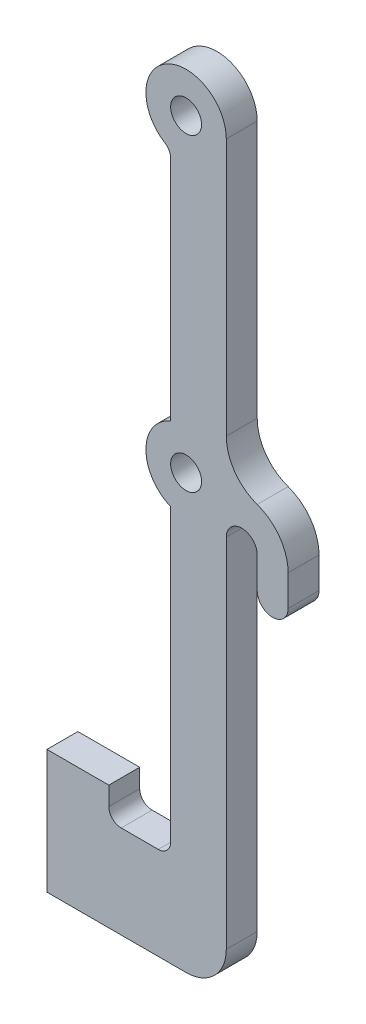
ISO-10303-21;
HEADER;
FILE_DESCRIPTION(('STEP AP214'),'2;1');
FILE_NAME('part.step','',(''),(''),'','','');
FILE_SCHEMA(('AUTOMOTIVE_DESIGN { 1 0 10303 214 1 1 1 1 }'));
ENDSEC;
DATA;
#1=APPLICATION_CONTEXT('core data for automotive mechanical design processes');
#2=APPLICATION_PROTOCOL_DEFINITION('international standard','automotive_design',2000,#1);
#3=PRODUCT_CONTEXT('',#1,'mechanical');
#4=PRODUCT('Part','Part','',(#3));
#5=PRODUCT_RELATED_PRODUCT_CATEGORY('part','',(#4));
#6=PRODUCT_DEFINITION_FORMATION('','',#4);
#7=PRODUCT_DEFINITION_CONTEXT('part definition',#1,'design');
#8=PRODUCT_DEFINITION('design','',#6,#7);
#9=PRODUCT_DEFINITION_SHAPE('','',#8);
#10=(LENGTH_UNIT() NAMED_UNIT(*) SI_UNIT(.MILLI.,.METRE.));
#11=(NAMED_UNIT(*) PLANE_ANGLE_UNIT() SI_UNIT($,.RADIAN.));
#12=(NAMED_UNIT(*) SI_UNIT($,.STERADIAN.) SOLID_ANGLE_UNIT());
#13=UNCERTAINTY_MEASURE_WITH_UNIT(LENGTH_MEASURE(1.E-05),#10,'distance_accuracy_value','');
#14=(GEOMETRIC_REPRESENTATION_CONTEXT(3) GLOBAL_UNCERTAINTY_ASSIGNED_CONTEXT((#13)) GLOBAL_UNIT_ASSIGNED_CONTEXT((#10,
#11,#12)) REPRESENTATION_CONTEXT('',''));
#15=CARTESIAN_POINT('',(0.,0.,0.));
#16=DIRECTION('',(0.,0.,1.));
#17=DIRECTION('',(1.,0.,0.));
#18=AXIS2_PLACEMENT_3D('',#15,#16,#17);
#19=CARTESIAN_POINT('',(8.255,0.,3.175));
#20=DIRECTION('',(1.,0.,0.));
#21=DIRECTION('',(0.,1.,0.));
#22=AXIS2_PLACEMENT_3D('',#19,#20,#21);
#23=PLANE('',#22);
#24=DIRECTION('',(0.,-1.,0.));
#25=VECTOR('',#24,1.);
#26=CARTESIAN_POINT('',(8.255,0.,3.175));
#27=LINE('',#26,#25);
#28=CARTESIAN_POINT('',(8.255,0.,3.175));
#29=VERTEX_POINT('',#28);
#30=CARTESIAN_POINT('',(8.255,-52.8619115344498,3.175));
#31=VERTEX_POINT('',#30);
#32=EDGE_CURVE('E282',#29,#31,#27,.T.);
#33=ORIENTED_EDGE('',*,*,#32,.T.);
#34=DIRECTION('',(0.,0.,1.));
#35=VECTOR('',#34,1.);
#36=CARTESIAN_POINT('',(8.255,-52.8619115344498,-3.175));
#37=LINE('',#36,#35);
#38=CARTESIAN_POINT('',(8.255,-52.8619115344498,-3.175));
#39=VERTEX_POINT('',#38);
#40=EDGE_CURVE('E240',#39,#31,#37,.T.);
#41=ORIENTED_EDGE('',*,*,#40,.F.);
#42=DIRECTION('',(0.,-1.,0.));
#43=VECTOR('',#42,1.);
#44=CARTESIAN_POINT('',(8.255,0.,-3.175));
#45=LINE('',#44,#43);
#46=CARTESIAN_POINT('',(8.255,0.,-3.175));
#47=VERTEX_POINT('',#46);
#48=EDGE_CURVE('E321',#47,#39,#45,.T.);
#49=ORIENTED_EDGE('',*,*,#48,.F.);
#50=DIRECTION('',(0.,0.,-1.));
#51=VECTOR('',#50,1.);
#52=CARTESIAN_POINT('',(8.255,0.,3.175));
#53=LINE('',#52,#51);
#54=EDGE_CURVE('E287',#29,#47,#53,.T.);
#55=ORIENTED_EDGE('',*,*,#54,.F.);
#56=EDGE_LOOP('',(#33,#41,#49,#55));
#57=FACE_BOUND('',#56,.T.);
#58=ADVANCED_FACE('F47',(#57),#23,.T.);
#59=CARTESIAN_POINT('',(-3.175,0.,3.175));
#60=DIRECTION('',(1.,0.,0.));
#61=DIRECTION('',(0.,1.,0.));
#62=AXIS2_PLACEMENT_3D('',#59,#60,#61);
#63=PLANE('',#62);
#64=DIRECTION('',(0.,-1.,0.));
#65=VECTOR('',#64,1.);
#66=CARTESIAN_POINT('',(-3.175,0.,3.175));
#67=LINE('',#66,#65);
#68=CARTESIAN_POINT('',(-3.175,-9.15810023967853,3.175));
#69=VERTEX_POINT('',#68);
#70=CARTESIAN_POINT('',(-3.17499999999999,-55.88,3.175));
#71=VERTEX_POINT('',#70);
#72=EDGE_CURVE('E256',#69,#71,#67,.T.);
#73=ORIENTED_EDGE('',*,*,#72,.F.);
#74=DIRECTION('',(0.,0.,1.));
#75=VECTOR('',#74,1.);
#76=CARTESIAN_POINT('',(-3.175,-9.15810023967853,-3.175));
#77=LINE('',#76,#75);
#78=CARTESIAN_POINT('',(-3.175,-9.15810023967853,-3.175));
#79=VERTEX_POINT('',#78);
#80=EDGE_CURVE('E355',#69,#79,#77,.F.);
#81=ORIENTED_EDGE('',*,*,#80,.T.);
#82=DIRECTION('',(0.,-1.,0.));
#83=VECTOR('',#82,1.);
#84=CARTESIAN_POINT('',(-3.175,0.,-3.175));
#85=LINE('',#84,#83);
#86=CARTESIAN_POINT('',(-3.17499999999999,-55.88,-3.175));
#87=VERTEX_POINT('',#86);
#88=EDGE_CURVE('E293',#79,#87,#85,.T.);
#89=ORIENTED_EDGE('',*,*,#88,.T.);
#90=DIRECTION('',(0.,0.,-1.));
#91=VECTOR('',#90,1.);
#92=CARTESIAN_POINT('',(-3.17499999999999,-55.88,3.175));
#93=LINE('',#92,#91);
#94=EDGE_CURVE('E352',#71,#87,#93,.T.);
#95=ORIENTED_EDGE('',*,*,#94,.F.);
#96=EDGE_LOOP('',(#73,#81,#89,#95));
#97=FACE_BOUND('',#96,.T.);
#98=ADVANCED_FACE('F372',(#97),#63,.F.);
#99=CARTESIAN_POINT('',(0.,-63.5,3.175));
#100=DIRECTION('',(0.,0.,-1.));
#101=DIRECTION('',(-1.,0.,0.));
#102=AXIS2_PLACEMENT_3D('',#99,#100,#101);
#103=CYLINDRICAL_SURFACE('',#102,8.255);
#104=CARTESIAN_POINT('',(0.,-63.5,-3.175));
#105=DIRECTION('',(0.,0.,1.));
#106=DIRECTION('',(1.,0.,0.));
#107=AXIS2_PLACEMENT_3D('',#104,#105,#106);
#108=CIRCLE('',#107,8.255);
#109=CARTESIAN_POINT('',(-3.17499999999999,-71.12,-3.175));
#110=VERTEX_POINT('',#109);
#111=EDGE_CURVE('E295',#87,#110,#108,.T.);
#112=ORIENTED_EDGE('',*,*,#111,.T.);
#113=DIRECTION('',(0.,0.,-1.));
#114=VECTOR('',#113,1.);
#115=CARTESIAN_POINT('',(-3.17499999999999,-71.12,3.175));
#116=LINE('',#115,#114);
#117=CARTESIAN_POINT('',(-3.17499999999999,-71.12,3.175));
#118=VERTEX_POINT('',#117);
#119=EDGE_CURVE('E349',#118,#110,#116,.T.);
#120=ORIENTED_EDGE('',*,*,#119,.F.);
#121=CARTESIAN_POINT('',(0.,-63.5,3.175));
#122=DIRECTION('',(0.,0.,1.));
#123=DIRECTION('',(1.,0.,0.));
#124=AXIS2_PLACEMENT_3D('',#121,#122,#123);
#125=CIRCLE('',#124,8.255);
#126=EDGE_CURVE('E258',#71,#118,#125,.T.);
#127=ORIENTED_EDGE('',*,*,#126,.F.);
#128=ORIENTED_EDGE('',*,*,#94,.T.);
#129=EDGE_LOOP('',(#112,#120,#127,#128));
#130=FACE_BOUND('',#129,.T.);
#131=ADVANCED_FACE('F374',(#130),#103,.T.);
#132=CARTESIAN_POINT('',(-3.175,0.,3.175));
#133=DIRECTION('',(1.,0.,0.));
#134=DIRECTION('',(0.,1.,0.));
#135=AXIS2_PLACEMENT_3D('',#132,#133,#134);
#136=PLANE('',#135);
#137=DIRECTION('',(0.,-1.,0.));
#138=VECTOR('',#137,1.);
#139=CARTESIAN_POINT('',(-3.175,0.,-3.175));
#140=LINE('',#139,#138);
#141=CARTESIAN_POINT('',(-3.17499999999998,-130.81,-3.175));
#142=VERTEX_POINT('',#141);
#143=EDGE_CURVE('E297',#110,#142,#140,.T.);
#144=ORIENTED_EDGE('',*,*,#143,.T.);
#145=DIRECTION('',(0.,0.,-1.));
#146=VECTOR('',#145,1.);
#147=CARTESIAN_POINT('',(-3.17499999999998,-130.81,3.175));
#148=LINE('',#147,#146);
#149=CARTESIAN_POINT('',(-3.17499999999998,-130.81,3.175));
#150=VERTEX_POINT('',#149);
#151=EDGE_CURVE('E347',#150,#142,#148,.T.);
#152=ORIENTED_EDGE('',*,*,#151,.F.);
#153=DIRECTION('',(0.,-1.,0.));
#154=VECTOR('',#153,1.);
#155=CARTESIAN_POINT('',(-3.175,0.,3.175));
#156=LINE('',#155,#154);
#157=EDGE_CURVE('E260',#118,#150,#156,.T.);
#158=ORIENTED_EDGE('',*,*,#157,.F.);
#159=ORIENTED_EDGE('',*,*,#119,.T.);
#160=EDGE_LOOP('',(#144,#152,#158,#159));
#161=FACE_BOUND('',#160,.T.);
#162=ADVANCED_FACE('F380',(#161),#136,.F.);
#163=CARTESIAN_POINT('',(-5.71499999999999,-130.81,3.175));
#164=DIRECTION('',(0.,0.,-1.));
#165=DIRECTION('',(-1.,0.,0.));
#166=AXIS2_PLACEMENT_3D('',#163,#164,#165);
#167=CYLINDRICAL_SURFACE('',#166,2.53999999999999);
#168=CARTESIAN_POINT('',(-5.71499999999999,-130.81,-3.175));
#169=DIRECTION('',(0.,0.,1.));
#170=DIRECTION('',(1.,0.,0.));
#171=AXIS2_PLACEMENT_3D('',#168,#169,#170);
#172=CIRCLE('',#171,2.53999999999999);
#173=CARTESIAN_POINT('',(-5.71499999999999,-133.35,-3.175));
#174=VERTEX_POINT('',#173);
#175=EDGE_CURVE('E300',#174,#142,#172,.T.);
#176=ORIENTED_EDGE('',*,*,#175,.F.);
#177=DIRECTION('',(0.,0.,-1.));
#178=VECTOR('',#177,1.);
#179=CARTESIAN_POINT('',(-5.71499999999999,-133.35,3.175));
#180=LINE('',#179,#178);
#181=CARTESIAN_POINT('',(-5.71499999999999,-133.35,3.175));
#182=VERTEX_POINT('',#181);
#183=EDGE_CURVE('E345',#182,#174,#180,.T.);
#184=ORIENTED_EDGE('',*,*,#183,.F.);
#185=CARTESIAN_POINT('',(-5.71499999999999,-130.81,3.175));
#186=DIRECTION('',(0.,0.,1.));
#187=DIRECTION('',(1.,0.,0.));
#188=AXIS2_PLACEMENT_3D('',#185,#186,#187);
#189=CIRCLE('',#188,2.53999999999999);
#190=EDGE_CURVE('E262',#182,#150,#189,.T.);
#191=ORIENTED_EDGE('',*,*,#190,.T.);
#192=ORIENTED_EDGE('',*,*,#151,.T.);
#193=EDGE_LOOP('',(#176,#184,#191,#192));
#194=FACE_BOUND('',#193,.T.);
#195=ADVANCED_FACE('F384',(#194),#167,.F.);
#196=CARTESIAN_POINT('',(0.,-133.35,3.175));
#197=DIRECTION('',(0.,-1.,0.));
#198=DIRECTION('',(0.,0.,-1.));
#199=AXIS2_PLACEMENT_3D('',#196,#197,#198);
#200=PLANE('',#199);
#201=DIRECTION('',(-1.,0.,0.));
#202=VECTOR('',#201,1.);
#203=CARTESIAN_POINT('',(0.,-133.35,-3.175));
#204=LINE('',#203,#202);
#205=CARTESIAN_POINT('',(-13.335,-133.35,-3.175));
#206=VERTEX_POINT('',#205);
#207=EDGE_CURVE('E303',#174,#206,#204,.T.);
#208=ORIENTED_EDGE('',*,*,#207,.T.);
#209=DIRECTION('',(0.,0.,-1.));
#210=VECTOR('',#209,1.);
#211=CARTESIAN_POINT('',(-13.335,-133.35,3.175));
#212=LINE('',#211,#210);
#213=CARTESIAN_POINT('',(-13.335,-133.35,3.175));
#214=VERTEX_POINT('',#213);
#215=EDGE_CURVE('E342',#214,#206,#212,.T.);
#216=ORIENTED_EDGE('',*,*,#215,.F.);
#217=DIRECTION('',(-1.,0.,0.));
#218=VECTOR('',#217,1.);
#219=CARTESIAN_POINT('',(0.,-133.35,3.175));
#220=LINE('',#219,#218);
#221=EDGE_CURVE('E265',#182,#214,#220,.T.);
#222=ORIENTED_EDGE('',*,*,#221,.F.);
#223=ORIENTED_EDGE('',*,*,#183,.T.);
#224=EDGE_LOOP('',(#208,#216,#222,#223));
#225=FACE_BOUND('',#224,.T.);
#226=ADVANCED_FACE('F389',(#225),#200,.F.);
#227=CARTESIAN_POINT('',(-13.335,-130.81,3.175));
#228=DIRECTION('',(0.,0.,-1.));
#229=DIRECTION('',(-1.,0.,0.));
#230=AXIS2_PLACEMENT_3D('',#227,#228,#229);
#231=CYLINDRICAL_SURFACE('',#230,2.53999999999998);
#232=CARTESIAN_POINT('',(-13.335,-130.81,-3.175));
#233=DIRECTION('',(0.,0.,1.));
#234=DIRECTION('',(1.,0.,0.));
#235=AXIS2_PLACEMENT_3D('',#232,#233,#234);
#236=CIRCLE('',#235,2.53999999999998);
#237=CARTESIAN_POINT('',(-15.875,-130.81,-3.175));
#238=VERTEX_POINT('',#237);
#239=EDGE_CURVE('E305',#206,#238,#236,.F.);
#240=ORIENTED_EDGE('',*,*,#239,.T.);
#241=DIRECTION('',(0.,0.,-1.));
#242=VECTOR('',#241,1.);
#243=CARTESIAN_POINT('',(-15.875,-130.81,3.175));
#244=LINE('',#243,#242);
#245=CARTESIAN_POINT('',(-15.875,-130.81,3.175));
#246=VERTEX_POINT('',#245);
#247=EDGE_CURVE('E339',#246,#238,#244,.T.);
#248=ORIENTED_EDGE('',*,*,#247,.F.);
#249=CARTESIAN_POINT('',(-13.335,-130.81,3.175));
#250=DIRECTION('',(0.,0.,1.));
#251=DIRECTION('',(1.,0.,0.));
#252=AXIS2_PLACEMENT_3D('',#249,#250,#251);
#253=CIRCLE('',#252,2.53999999999998);
#254=EDGE_CURVE('E267',#214,#246,#253,.F.);
#255=ORIENTED_EDGE('',*,*,#254,.F.);
#256=ORIENTED_EDGE('',*,*,#215,.T.);
#257=EDGE_LOOP('',(#240,#248,#255,#256));
#258=FACE_BOUND('',#257,.T.);
#259=ADVANCED_FACE('F395',(#258),#231,.F.);
#260=CARTESIAN_POINT('',(-15.875,0.,3.175));
#261=DIRECTION('',(-1.,0.,0.));
#262=DIRECTION('',(0.,0.,1.));
#263=AXIS2_PLACEMENT_3D('',#260,#261,#262);
#264=PLANE('',#263);
#265=DIRECTION('',(0.,1.,0.));
#266=VECTOR('',#265,1.);
#267=CARTESIAN_POINT('',(-15.875,0.,-3.175));
#268=LINE('',#267,#266);
#269=CARTESIAN_POINT('',(-15.875,-127.,-3.175));
#270=VERTEX_POINT('',#269);
#271=EDGE_CURVE('E307',#238,#270,#268,.T.);
#272=ORIENTED_EDGE('',*,*,#271,.T.);
#273=DIRECTION('',(0.,0.,-1.));
#274=VECTOR('',#273,1.);
#275=CARTESIAN_POINT('',(-15.875,-127.,3.175));
#276=LINE('',#275,#274);
#277=CARTESIAN_POINT('',(-15.875,-127.,3.175));
#278=VERTEX_POINT('',#277);
#279=EDGE_CURVE('E336',#278,#270,#276,.T.);
#280=ORIENTED_EDGE('',*,*,#279,.F.);
#281=DIRECTION('',(0.,1.,0.));
#282=VECTOR('',#281,1.);
#283=CARTESIAN_POINT('',(-15.875,0.,3.175));
#284=LINE('',#283,#282);
#285=EDGE_CURVE('E269',#246,#278,#284,.T.);
#286=ORIENTED_EDGE('',*,*,#285,.F.);
#287=ORIENTED_EDGE('',*,*,#247,.T.);
#288=EDGE_LOOP('',(#272,#280,#286,#287));
#289=FACE_BOUND('',#288,.T.);
#290=ADVANCED_FACE('F399',(#289),#264,.F.);
#291=CARTESIAN_POINT('',(0.,-127.,3.175));
#292=DIRECTION('',(0.,-1.,0.));
#293=DIRECTION('',(0.,0.,-1.));
#294=AXIS2_PLACEMENT_3D('',#291,#292,#293);
#295=PLANE('',#294);
#296=DIRECTION('',(-1.,0.,0.));
#297=VECTOR('',#296,1.);
#298=CARTESIAN_POINT('',(0.,-127.,-3.175));
#299=LINE('',#298,#297);
#300=CARTESIAN_POINT('',(-28.575,-127.,-3.175));
#301=VERTEX_POINT('',#300);
#302=EDGE_CURVE('E309',#270,#301,#299,.T.);
#303=ORIENTED_EDGE('',*,*,#302,.T.);
#304=DIRECTION('',(0.,0.,-1.));
#305=VECTOR('',#304,1.);
#306=CARTESIAN_POINT('',(-28.575,-127.,3.175));
#307=LINE('',#306,#305);
#308=CARTESIAN_POINT('',(-28.575,-127.,3.175));
#309=VERTEX_POINT('',#308);
#310=EDGE_CURVE('E333',#309,#301,#307,.T.);
#311=ORIENTED_EDGE('',*,*,#310,.F.);
#312=DIRECTION('',(-1.,0.,0.));
#313=VECTOR('',#312,1.);
#314=CARTESIAN_POINT('',(0.,-127.,3.175));
#315=LINE('',#314,#313);
#316=EDGE_CURVE('E271',#278,#309,#315,.T.);
#317=ORIENTED_EDGE('',*,*,#316,.F.);
#318=ORIENTED_EDGE('',*,*,#279,.T.);
#319=EDGE_LOOP('',(#303,#311,#317,#318));
#320=FACE_BOUND('',#319,.T.);
#321=ADVANCED_FACE('F404',(#320),#295,.F.);
#322=CARTESIAN_POINT('',(-28.575,0.,3.175));
#323=DIRECTION('',(1.,0.,0.));
#324=DIRECTION('',(0.,0.,-1.));
#325=AXIS2_PLACEMENT_3D('',#322,#323,#324);
#326=PLANE('',#325);
#327=DIRECTION('',(0.,-1.,0.));
#328=VECTOR('',#327,1.);
#329=CARTESIAN_POINT('',(-28.575,0.,-3.175));
#330=LINE('',#329,#328);
#331=CARTESIAN_POINT('',(-28.575,-152.4,-3.175));
#332=VERTEX_POINT('',#331);
#333=EDGE_CURVE('E311',#301,#332,#330,.T.);
#334=ORIENTED_EDGE('',*,*,#333,.T.);
#335=DIRECTION('',(0.,0.,-1.));
#336=VECTOR('',#335,1.);
#337=CARTESIAN_POINT('',(-28.575,-152.4,3.175));
#338=LINE('',#337,#336);
#339=CARTESIAN_POINT('',(-28.575,-152.4,3.175));
#340=VERTEX_POINT('',#339);
#341=EDGE_CURVE('E331',#340,#332,#338,.T.);
#342=ORIENTED_EDGE('',*,*,#341,.F.);
#343=DIRECTION('',(0.,-1.,0.));
#344=VECTOR('',#343,1.);
#345=CARTESIAN_POINT('',(-28.575,0.,3.175));
#346=LINE('',#345,#344);
#347=EDGE_CURVE('E273',#309,#340,#346,.T.);
#348=ORIENTED_EDGE('',*,*,#347,.F.);
#349=ORIENTED_EDGE('',*,*,#310,.T.);
#350=EDGE_LOOP('',(#334,#342,#348,#349));
#351=FACE_BOUND('',#350,.T.);
#352=ADVANCED_FACE('F410',(#351),#326,.F.);
#353=CARTESIAN_POINT('',(0.,-152.4,3.175));
#354=DIRECTION('',(0.,-1.,0.));
#355=DIRECTION('',(0.,0.,-1.));
#356=AXIS2_PLACEMENT_3D('',#353,#354,#355);
#357=PLANE('',#356);
#358=DIRECTION('',(-1.,0.,0.));
#359=VECTOR('',#358,1.);
#360=CARTESIAN_POINT('',(0.,-152.4,-3.175));
#361=LINE('',#360,#359);
#362=CARTESIAN_POINT('',(0.,-152.4,-3.175));
#363=VERTEX_POINT('',#362);
#364=EDGE_CURVE('E314',#363,#332,#361,.T.);
#365=ORIENTED_EDGE('',*,*,#364,.F.);
#366=DIRECTION('',(0.,0.,-1.));
#367=VECTOR('',#366,1.);
#368=CARTESIAN_POINT('',(0.,-152.4,3.175));
#369=LINE('',#368,#367);
#370=CARTESIAN_POINT('',(0.,-152.4,3.175));
#371=VERTEX_POINT('',#370);
#372=EDGE_CURVE('E329',#371,#363,#369,.T.);
#373=ORIENTED_EDGE('',*,*,#372,.F.);
#374=DIRECTION('',(-1.,0.,0.));
#375=VECTOR('',#374,1.);
#376=CARTESIAN_POINT('',(0.,-152.4,3.175));
#377=LINE('',#376,#375);
#378=EDGE_CURVE('E275',#371,#340,#377,.T.);
#379=ORIENTED_EDGE('',*,*,#378,.T.);
#380=ORIENTED_EDGE('',*,*,#341,.T.);
#381=EDGE_LOOP('',(#365,#373,#379,#380));
#382=FACE_BOUND('',#381,.T.);
#383=ADVANCED_FACE('F414',(#382),#357,.T.);
#384=CARTESIAN_POINT('',(0.,-144.145,3.175));
#385=DIRECTION('',(0.,0.,-1.));
#386=DIRECTION('',(-1.,0.,0.));
#387=AXIS2_PLACEMENT_3D('',#384,#385,#386);
#388=CYLINDRICAL_SURFACE('',#387,8.25499999999999);
#389=CARTESIAN_POINT('',(0.,-144.145,-3.175));
#390=DIRECTION('',(0.,0.,1.));
#391=DIRECTION('',(1.,0.,0.));
#392=AXIS2_PLACEMENT_3D('',#389,#390,#391);
#393=CIRCLE('',#392,8.25499999999999);
#394=CARTESIAN_POINT('',(8.25500000000001,-144.145,-3.175));
#395=VERTEX_POINT('',#394);
#396=EDGE_CURVE('E317',#395,#363,#393,.F.);
#397=ORIENTED_EDGE('',*,*,#396,.F.);
#398=DIRECTION('',(0.,0.,-1.));
#399=VECTOR('',#398,1.);
#400=CARTESIAN_POINT('',(8.25500000000001,-144.145,3.175));
#401=LINE('',#400,#399);
#402=CARTESIAN_POINT('',(8.25500000000001,-144.145,3.175));
#403=VERTEX_POINT('',#402);
#404=EDGE_CURVE('E326',#403,#395,#401,.T.);
#405=ORIENTED_EDGE('',*,*,#404,.F.);
#406=CARTESIAN_POINT('',(0.,-144.145,3.175));
#407=DIRECTION('',(0.,0.,1.));
#408=DIRECTION('',(1.,0.,0.));
#409=AXIS2_PLACEMENT_3D('',#406,#407,#408);
#410=CIRCLE('',#409,8.25499999999999);
#411=EDGE_CURVE('E278',#403,#371,#410,.F.);
#412=ORIENTED_EDGE('',*,*,#411,.T.);
#413=ORIENTED_EDGE('',*,*,#372,.T.);
#414=EDGE_LOOP('',(#397,#405,#412,#413));
#415=FACE_BOUND('',#414,.T.);
#416=ADVANCED_FACE('F417',(#415),#388,.T.);
#417=DIRECTION('',(0.,0.,1.));
#418=VECTOR('',#417,1.);
#419=CARTESIAN_POINT('',(8.255,-70.8224237765881,-3.175));
#420=LINE('',#419,#418);
#421=CARTESIAN_POINT('',(8.25500000000001,-70.8224237765881,-3.175));
#422=VERTEX_POINT('',#421);
#423=CARTESIAN_POINT('',(8.255,-70.8224237765881,3.175));
#424=VERTEX_POINT('',#423);
#425=EDGE_CURVE('E211',#422,#424,#420,.T.);
#426=ORIENTED_EDGE('',*,*,#425,.T.);
#427=EDGE_CURVE('E281',#424,#403,#27,.T.);
#428=ORIENTED_EDGE('',*,*,#427,.T.);
#429=ORIENTED_EDGE('',*,*,#404,.T.);
#430=EDGE_CURVE('E320',#422,#395,#45,.T.);
#431=ORIENTED_EDGE('',*,*,#430,.F.);
#432=EDGE_LOOP('',(#426,#428,#429,#431));
#433=FACE_BOUND('',#432,.T.);
#434=ADVANCED_FACE('F421',(#433),#23,.T.);
#435=CARTESIAN_POINT('',(0.,-63.5,3.175));
#436=DIRECTION('',(0.,0.,-1.));
#437=DIRECTION('',(-1.,0.,0.));
#438=AXIS2_PLACEMENT_3D('',#435,#436,#437);
#439=CYLINDRICAL_SURFACE('',#438,3.175);
#440=CARTESIAN_POINT('',(0.,-63.5,3.175));
#441=DIRECTION('',(0.,0.,1.));
#442=DIRECTION('',(1.,0.,0.));
#443=AXIS2_PLACEMENT_3D('',#440,#441,#442);
#444=CIRCLE('',#443,3.175);
#445=CARTESIAN_POINT('',(3.17500000000001,-63.5,3.175));
#446=VERTEX_POINT('',#445);
#447=EDGE_CURVE('E252',#446,#446,#444,.T.);
#448=ORIENTED_EDGE('',*,*,#447,.T.);
#449=EDGE_LOOP('',(#448));
#450=FACE_BOUND('',#449,.T.);
#451=CARTESIAN_POINT('',(0.,-63.5,-3.175));
#452=DIRECTION('',(0.,0.,1.));
#453=DIRECTION('',(1.,0.,0.));
#454=AXIS2_PLACEMENT_3D('',#451,#452,#453);
#455=CIRCLE('',#454,3.175);
#456=CARTESIAN_POINT('',(3.17500000000001,-63.5,-3.175));
#457=VERTEX_POINT('',#456);
#458=EDGE_CURVE('E290',#457,#457,#455,.T.);
#459=ORIENTED_EDGE('',*,*,#458,.F.);
#460=EDGE_LOOP('',(#459));
#461=FACE_BOUND('',#460,.T.);
#462=ADVANCED_FACE('F423',(#450,#461),#439,.F.);
#463=CARTESIAN_POINT('',(0.,0.,3.175));
#464=DIRECTION('',(0.,0.,-1.));
#465=DIRECTION('',(-1.,0.,0.));
#466=AXIS2_PLACEMENT_3D('',#463,#464,#465);
#467=CYLINDRICAL_SURFACE('',#466,3.175);
#468=CARTESIAN_POINT('',(0.,0.,3.175));
#469=DIRECTION('',(0.,0.,1.));
#470=DIRECTION('',(1.,0.,0.));
#471=AXIS2_PLACEMENT_3D('',#468,#469,#470);
#472=CIRCLE('',#471,3.175);
#473=CARTESIAN_POINT('',(3.175,0.,3.175));
#474=VERTEX_POINT('',#473);
#475=EDGE_CURVE('E249',#474,#474,#472,.T.);
#476=ORIENTED_EDGE('',*,*,#475,.T.);
#477=EDGE_LOOP('',(#476));
#478=FACE_BOUND('',#477,.T.);
#479=CARTESIAN_POINT('',(0.,0.,-3.175));
#480=DIRECTION('',(0.,0.,1.));
#481=DIRECTION('',(1.,0.,0.));
#482=AXIS2_PLACEMENT_3D('',#479,#480,#481);
#483=CIRCLE('',#482,3.175);
#484=CARTESIAN_POINT('',(3.175,0.,-3.175));
#485=VERTEX_POINT('',#484);
#486=EDGE_CURVE('E239',#485,#485,#483,.T.);
#487=ORIENTED_EDGE('',*,*,#486,.F.);
#488=EDGE_LOOP('',(#487));
#489=FACE_BOUND('',#488,.T.);
#490=ADVANCED_FACE('F428',(#478,#489),#467,.F.);
#491=CARTESIAN_POINT('',(0.,0.,3.175));
#492=DIRECTION('',(0.,0.,-1.));
#493=DIRECTION('',(-1.,0.,0.));
#494=AXIS2_PLACEMENT_3D('',#491,#492,#493);
#495=CYLINDRICAL_SURFACE('',#494,8.255);
#496=CARTESIAN_POINT('',(0.,0.,-3.175));
#497=DIRECTION('',(0.,0.,1.));
#498=DIRECTION('',(1.,0.,0.));
#499=AXIS2_PLACEMENT_3D('',#496,#497,#498);
#500=CIRCLE('',#499,8.255);
#501=CARTESIAN_POINT('',(-4.37029411764706,-7.00325312446005,-3.175));
#502=VERTEX_POINT('',#501);
#503=EDGE_CURVE('E253',#47,#502,#500,.T.);
#504=ORIENTED_EDGE('',*,*,#503,.T.);
#505=DIRECTION('',(0.,0.,-1.));
#506=VECTOR('',#505,1.);
#507=CARTESIAN_POINT('',(-4.37029411764706,-7.00325312446005,3.175));
#508=LINE('',#507,#506);
#509=CARTESIAN_POINT('',(-4.37029411764706,-7.00325312446005,3.175));
#510=VERTEX_POINT('',#509);
#511=EDGE_CURVE('E70',#502,#510,#508,.F.);
#512=ORIENTED_EDGE('',*,*,#511,.T.);
#513=CARTESIAN_POINT('',(0.,0.,3.175));
#514=DIRECTION('',(0.,0.,1.));
#515=DIRECTION('',(1.,0.,0.));
#516=AXIS2_PLACEMENT_3D('',#513,#514,#515);
#517=CIRCLE('',#516,8.255);
#518=EDGE_CURVE('E285',#29,#510,#517,.T.);
#519=ORIENTED_EDGE('',*,*,#518,.F.);
#520=ORIENTED_EDGE('',*,*,#54,.T.);
#521=EDGE_LOOP('',(#504,#512,#519,#520));
#522=FACE_BOUND('',#521,.T.);
#523=ADVANCED_FACE('F363',(#522),#495,.T.);
#524=CARTESIAN_POINT('',(0.,0.,3.175));
#525=DIRECTION('',(0.,0.,1.));
#526=DIRECTION('',(1.,0.,0.));
#527=AXIS2_PLACEMENT_3D('',#524,#525,#526);
#528=PLANE('',#527);
#529=ORIENTED_EDGE('',*,*,#475,.F.);
#530=EDGE_LOOP('',(#529));
#531=FACE_BOUND('',#530,.T.);
#532=ORIENTED_EDGE('',*,*,#447,.F.);
#533=EDGE_LOOP('',(#532));
#534=FACE_BOUND('',#533,.T.);
#535=ORIENTED_EDGE('',*,*,#518,.T.);
#536=CARTESIAN_POINT('',(-5.715,-9.15810023967853,3.175));
#537=DIRECTION('',(0.,0.,1.));
#538=DIRECTION('',(1.,0.,0.));
#539=AXIS2_PLACEMENT_3D('',#536,#537,#538);
#540=CIRCLE('',#539,2.54);
#541=EDGE_CURVE('E11',#510,#69,#540,.F.);
#542=ORIENTED_EDGE('',*,*,#541,.T.);
#543=ORIENTED_EDGE('',*,*,#72,.T.);
#544=ORIENTED_EDGE('',*,*,#126,.T.);
#545=ORIENTED_EDGE('',*,*,#157,.T.);
#546=ORIENTED_EDGE('',*,*,#190,.F.);
#547=ORIENTED_EDGE('',*,*,#221,.T.);
#548=ORIENTED_EDGE('',*,*,#254,.T.);
#549=ORIENTED_EDGE('',*,*,#285,.T.);
#550=ORIENTED_EDGE('',*,*,#316,.T.);
#551=ORIENTED_EDGE('',*,*,#347,.T.);
#552=ORIENTED_EDGE('',*,*,#378,.F.);
#553=ORIENTED_EDGE('',*,*,#411,.F.);
#554=ORIENTED_EDGE('',*,*,#427,.F.);
#555=CARTESIAN_POINT('',(11.43,-70.8224237765881,3.175));
#556=DIRECTION('',(0.,0.,-1.));
#557=DIRECTION('',(1.,0.,0.));
#558=AXIS2_PLACEMENT_3D('',#555,#556,#557);
#559=CIRCLE('',#558,3.175);
#560=CARTESIAN_POINT('',(14.605,-70.8224237765881,3.175));
#561=VERTEX_POINT('',#560);
#562=EDGE_CURVE('E227',#424,#561,#559,.T.);
#563=ORIENTED_EDGE('',*,*,#562,.T.);
#564=DIRECTION('',(0.,-1.,0.));
#565=VECTOR('',#564,1.);
#566=CARTESIAN_POINT('',(14.605,-70.8224237765881,3.175));
#567=LINE('',#566,#565);
#568=CARTESIAN_POINT('',(14.605,-77.1724237765881,3.175));
#569=VERTEX_POINT('',#568);
#570=EDGE_CURVE('E196',#561,#569,#567,.T.);
#571=ORIENTED_EDGE('',*,*,#570,.T.);
#572=CARTESIAN_POINT('',(17.78,-77.1724237765881,3.175));
#573=DIRECTION('',(0.,0.,1.));
#574=DIRECTION('',(1.,0.,0.));
#575=AXIS2_PLACEMENT_3D('',#572,#573,#574);
#576=CIRCLE('',#575,3.17500000000001);
#577=CARTESIAN_POINT('',(20.955,-77.1724237765881,3.175));
#578=VERTEX_POINT('',#577);
#579=EDGE_CURVE('E230',#569,#578,#576,.T.);
#580=ORIENTED_EDGE('',*,*,#579,.T.);
#581=DIRECTION('',(0.,1.,0.));
#582=VECTOR('',#581,1.);
#583=CARTESIAN_POINT('',(20.955,-77.1724237765881,3.175));
#584=LINE('',#583,#582);
#585=CARTESIAN_POINT('',(20.955,-70.8224237765881,3.175));
#586=VERTEX_POINT('',#585);
#587=EDGE_CURVE('E233',#578,#586,#584,.T.);
#588=ORIENTED_EDGE('',*,*,#587,.T.);
#589=CARTESIAN_POINT('',(11.43,-70.8224237765881,3.175));
#590=DIRECTION('',(0.,0.,1.));
#591=DIRECTION('',(1.,0.,0.));
#592=AXIS2_PLACEMENT_3D('',#589,#590,#591);
#593=CIRCLE('',#592,9.52500000000002);
#594=CARTESIAN_POINT('',(14.605,-61.8421676555189,3.175));
#595=VERTEX_POINT('',#594);
#596=EDGE_CURVE('E216',#586,#595,#593,.T.);
#597=ORIENTED_EDGE('',*,*,#596,.T.);
#598=CARTESIAN_POINT('',(17.78,-52.8619115344498,3.175));
#599=DIRECTION('',(0.,0.,-1.));
#600=DIRECTION('',(-1.,0.,0.));
#601=AXIS2_PLACEMENT_3D('',#598,#599,#600);
#602=CIRCLE('',#601,9.52500000000002);
#603=EDGE_CURVE('E213',#595,#31,#602,.T.);
#604=ORIENTED_EDGE('',*,*,#603,.T.);
#605=ORIENTED_EDGE('',*,*,#32,.F.);
#606=EDGE_LOOP('',(#535,#542,#543,#544,#545,#546,#547,#548,#549,#550,#551,#552,#553,#554,#563,
#571,#580,#588,#597,#604,#605));
#607=FACE_BOUND('',#606,.T.);
#608=ADVANCED_FACE('F367',(#531,#534,#607),#528,.T.);
#609=CARTESIAN_POINT('',(0.,0.,-3.175));
#610=DIRECTION('',(0.,0.,1.));
#611=DIRECTION('',(1.,0.,0.));
#612=AXIS2_PLACEMENT_3D('',#609,#610,#611);
#613=PLANE('',#612);
#614=ORIENTED_EDGE('',*,*,#486,.T.);
#615=EDGE_LOOP('',(#614));
#616=FACE_BOUND('',#615,.T.);
#617=ORIENTED_EDGE('',*,*,#458,.T.);
#618=EDGE_LOOP('',(#617));
#619=FACE_BOUND('',#618,.T.);
#620=ORIENTED_EDGE('',*,*,#88,.F.);
#621=CARTESIAN_POINT('',(-5.715,-9.15810023967853,-3.175));
#622=DIRECTION('',(0.,0.,1.));
#623=DIRECTION('',(1.,0.,0.));
#624=AXIS2_PLACEMENT_3D('',#621,#622,#623);
#625=CIRCLE('',#624,2.54);
#626=EDGE_CURVE('E55',#79,#502,#625,.T.);
#627=ORIENTED_EDGE('',*,*,#626,.T.);
#628=ORIENTED_EDGE('',*,*,#503,.F.);
#629=ORIENTED_EDGE('',*,*,#48,.T.);
#630=CARTESIAN_POINT('',(17.78,-52.8619115344498,-3.175));
#631=DIRECTION('',(0.,0.,-1.));
#632=DIRECTION('',(-1.,0.,0.));
#633=AXIS2_PLACEMENT_3D('',#630,#631,#632);
#634=CIRCLE('',#633,9.52500000000002);
#635=CARTESIAN_POINT('',(14.605,-61.8421676555189,-3.175));
#636=VERTEX_POINT('',#635);
#637=EDGE_CURVE('E200',#636,#39,#634,.T.);
#638=ORIENTED_EDGE('',*,*,#637,.F.);
#639=CARTESIAN_POINT('',(11.43,-70.8224237765881,-3.175));
#640=DIRECTION('',(0.,0.,1.));
#641=DIRECTION('',(1.,0.,0.));
#642=AXIS2_PLACEMENT_3D('',#639,#640,#641);
#643=CIRCLE('',#642,9.52500000000002);
#644=CARTESIAN_POINT('',(20.955,-70.8224237765881,-3.175));
#645=VERTEX_POINT('',#644);
#646=EDGE_CURVE('E223',#645,#636,#643,.T.);
#647=ORIENTED_EDGE('',*,*,#646,.F.);
#648=DIRECTION('',(0.,1.,0.));
#649=VECTOR('',#648,1.);
#650=CARTESIAN_POINT('',(20.955,-77.1724237765881,-3.175));
#651=LINE('',#650,#649);
#652=CARTESIAN_POINT('',(20.955,-77.1724237765881,-3.175));
#653=VERTEX_POINT('',#652);
#654=EDGE_CURVE('E220',#653,#645,#651,.T.);
#655=ORIENTED_EDGE('',*,*,#654,.F.);
#656=CARTESIAN_POINT('',(17.78,-77.1724237765881,-3.175));
#657=DIRECTION('',(0.,0.,1.));
#658=DIRECTION('',(1.,0.,0.));
#659=AXIS2_PLACEMENT_3D('',#656,#657,#658);
#660=CIRCLE('',#659,3.17500000000001);
#661=CARTESIAN_POINT('',(14.605,-77.1724237765881,-3.175));
#662=VERTEX_POINT('',#661);
#663=EDGE_CURVE('E207',#662,#653,#660,.T.);
#664=ORIENTED_EDGE('',*,*,#663,.F.);
#665=DIRECTION('',(0.,-1.,0.));
#666=VECTOR('',#665,1.);
#667=CARTESIAN_POINT('',(14.605,-70.8224237765881,-3.175));
#668=LINE('',#667,#666);
#669=CARTESIAN_POINT('',(14.605,-70.8224237765881,-3.175));
#670=VERTEX_POINT('',#669);
#671=EDGE_CURVE('E194',#670,#662,#668,.T.);
#672=ORIENTED_EDGE('',*,*,#671,.F.);
#673=CARTESIAN_POINT('',(11.43,-70.8224237765881,-3.175));
#674=DIRECTION('',(0.,0.,-1.));
#675=DIRECTION('',(1.,0.,0.));
#676=AXIS2_PLACEMENT_3D('',#673,#674,#675);
#677=CIRCLE('',#676,3.175);
#678=EDGE_CURVE('E62',#422,#670,#677,.T.);
#679=ORIENTED_EDGE('',*,*,#678,.F.);
#680=ORIENTED_EDGE('',*,*,#430,.T.);
#681=ORIENTED_EDGE('',*,*,#396,.T.);
#682=ORIENTED_EDGE('',*,*,#364,.T.);
#683=ORIENTED_EDGE('',*,*,#333,.F.);
#684=ORIENTED_EDGE('',*,*,#302,.F.);
#685=ORIENTED_EDGE('',*,*,#271,.F.);
#686=ORIENTED_EDGE('',*,*,#239,.F.);
#687=ORIENTED_EDGE('',*,*,#207,.F.);
#688=ORIENTED_EDGE('',*,*,#175,.T.);
#689=ORIENTED_EDGE('',*,*,#143,.F.);
#690=ORIENTED_EDGE('',*,*,#111,.F.);
#691=EDGE_LOOP('',(#620,#627,#628,#629,#638,#647,#655,#664,#672,#679,#680,#681,#682,#683,#684,
#685,#686,#687,#688,#689,#690));
#692=FACE_BOUND('',#691,.T.);
#693=ADVANCED_FACE('F204',(#616,#619,#692),#613,.F.);
#694=CARTESIAN_POINT('',(-5.715,-9.15810023967853,3.175));
#695=DIRECTION('',(0.,0.,-1.));
#696=DIRECTION('',(-1.,0.,0.));
#697=AXIS2_PLACEMENT_3D('',#694,#695,#696);
#698=CYLINDRICAL_SURFACE('',#697,2.54);
#699=ORIENTED_EDGE('',*,*,#541,.F.);
#700=ORIENTED_EDGE('',*,*,#511,.F.);
#701=ORIENTED_EDGE('',*,*,#626,.F.);
#702=ORIENTED_EDGE('',*,*,#80,.F.);
#703=EDGE_LOOP('',(#699,#700,#701,#702));
#704=FACE_BOUND('',#703,.T.);
#705=ADVANCED_FACE('F49',(#704),#698,.F.);
#706=CARTESIAN_POINT('',(11.43,-70.8224237765881,-3.175));
#707=DIRECTION('',(0.,0.,1.));
#708=DIRECTION('',(1.,0.,0.));
#709=AXIS2_PLACEMENT_3D('',#706,#707,#708);
#710=CYLINDRICAL_SURFACE('',#709,3.175);
#711=ORIENTED_EDGE('',*,*,#562,.F.);
#712=ORIENTED_EDGE('',*,*,#425,.F.);
#713=ORIENTED_EDGE('',*,*,#678,.T.);
#714=DIRECTION('',(0.,0.,1.));
#715=VECTOR('',#714,1.);
#716=CARTESIAN_POINT('',(14.605,-70.8224237765881,-3.175));
#717=LINE('',#716,#715);
#718=EDGE_CURVE('E192',#670,#561,#717,.T.);
#719=ORIENTED_EDGE('',*,*,#718,.T.);
#720=EDGE_LOOP('',(#711,#712,#713,#719));
#721=FACE_BOUND('',#720,.T.);
#722=ADVANCED_FACE('F209',(#721),#710,.F.);
#723=CARTESIAN_POINT('',(17.78,-52.8619115344498,-3.175));
#724=DIRECTION('',(0.,0.,1.));
#725=DIRECTION('',(1.,0.,0.));
#726=AXIS2_PLACEMENT_3D('',#723,#724,#725);
#727=CYLINDRICAL_SURFACE('',#726,9.52500000000002);
#728=ORIENTED_EDGE('',*,*,#603,.F.);
#729=DIRECTION('',(0.,0.,1.));
#730=VECTOR('',#729,1.);
#731=CARTESIAN_POINT('',(14.605,-61.8421676555189,-3.175));
#732=LINE('',#731,#730);
#733=EDGE_CURVE('E242',#636,#595,#732,.T.);
#734=ORIENTED_EDGE('',*,*,#733,.F.);
#735=ORIENTED_EDGE('',*,*,#637,.T.);
#736=ORIENTED_EDGE('',*,*,#40,.T.);
#737=EDGE_LOOP('',(#728,#734,#735,#736));
#738=FACE_BOUND('',#737,.T.);
#739=ADVANCED_FACE('F444',(#738),#727,.F.);
#740=CARTESIAN_POINT('',(11.43,-70.8224237765881,-3.175));
#741=DIRECTION('',(0.,0.,1.));
#742=DIRECTION('',(1.,0.,0.));
#743=AXIS2_PLACEMENT_3D('',#740,#741,#742);
#744=CYLINDRICAL_SURFACE('',#743,9.52500000000002);
#745=ORIENTED_EDGE('',*,*,#596,.F.);
#746=DIRECTION('',(0.,0.,1.));
#747=VECTOR('',#746,1.);
#748=CARTESIAN_POINT('',(20.955,-70.8224237765881,-3.175));
#749=LINE('',#748,#747);
#750=EDGE_CURVE('E244',#645,#586,#749,.T.);
#751=ORIENTED_EDGE('',*,*,#750,.F.);
#752=ORIENTED_EDGE('',*,*,#646,.T.);
#753=ORIENTED_EDGE('',*,*,#733,.T.);
#754=EDGE_LOOP('',(#745,#751,#752,#753));
#755=FACE_BOUND('',#754,.T.);
#756=ADVANCED_FACE('F448',(#755),#744,.T.);
#757=CARTESIAN_POINT('',(20.955,-77.1724237765881,-3.175));
#758=DIRECTION('',(1.,0.,0.));
#759=DIRECTION('',(0.,0.,-1.));
#760=AXIS2_PLACEMENT_3D('',#757,#758,#759);
#761=PLANE('',#760);
#762=ORIENTED_EDGE('',*,*,#587,.F.);
#763=DIRECTION('',(0.,0.,1.));
#764=VECTOR('',#763,1.);
#765=CARTESIAN_POINT('',(20.955,-77.1724237765881,-3.175));
#766=LINE('',#765,#764);
#767=EDGE_CURVE('E246',#653,#578,#766,.T.);
#768=ORIENTED_EDGE('',*,*,#767,.F.);
#769=ORIENTED_EDGE('',*,*,#654,.T.);
#770=ORIENTED_EDGE('',*,*,#750,.T.);
#771=EDGE_LOOP('',(#762,#768,#769,#770));
#772=FACE_BOUND('',#771,.T.);
#773=ADVANCED_FACE('F451',(#772),#761,.T.);
#774=CARTESIAN_POINT('',(17.78,-77.1724237765881,-3.175));
#775=DIRECTION('',(0.,0.,1.));
#776=DIRECTION('',(1.,0.,0.));
#777=AXIS2_PLACEMENT_3D('',#774,#775,#776);
#778=CYLINDRICAL_SURFACE('',#777,3.17500000000001);
#779=ORIENTED_EDGE('',*,*,#579,.F.);
#780=DIRECTION('',(0.,0.,1.));
#781=VECTOR('',#780,1.);
#782=CARTESIAN_POINT('',(14.605,-77.1724237765881,-3.175));
#783=LINE('',#782,#781);
#784=EDGE_CURVE('E199',#662,#569,#783,.T.);
#785=ORIENTED_EDGE('',*,*,#784,.F.);
#786=ORIENTED_EDGE('',*,*,#663,.T.);
#787=ORIENTED_EDGE('',*,*,#767,.T.);
#788=EDGE_LOOP('',(#779,#785,#786,#787));
#789=FACE_BOUND('',#788,.T.);
#790=ADVANCED_FACE('F454',(#789),#778,.T.);
#791=CARTESIAN_POINT('',(14.605,-70.8224237765881,-3.175));
#792=DIRECTION('',(-1.,0.,0.));
#793=DIRECTION('',(0.,0.,1.));
#794=AXIS2_PLACEMENT_3D('',#791,#792,#793);
#795=PLANE('',#794);
#796=ORIENTED_EDGE('',*,*,#570,.F.);
#797=ORIENTED_EDGE('',*,*,#718,.F.);
#798=ORIENTED_EDGE('',*,*,#671,.T.);
#799=ORIENTED_EDGE('',*,*,#784,.T.);
#800=EDGE_LOOP('',(#796,#797,#798,#799));
#801=FACE_BOUND('',#800,.T.);
#802=ADVANCED_FACE('F193',(#801),#795,.T.);
#803=CLOSED_SHELL('',(#58,#98,#131,#162,#195,#226,#259,#290,#321,#352,#383,#416,#434,#462,#490,
#523,#608,#693,#705,#722,#739,#756,#773,#790,#802));
#804=MANIFOLD_SOLID_BREP('B2',#803);
#805=ADVANCED_BREP_SHAPE_REPRESENTATION('',(#18,#804),#14);
#806=SHAPE_DEFINITION_REPRESENTATION(#9,#805);
ENDSEC;
END-ISO-10303-21;
